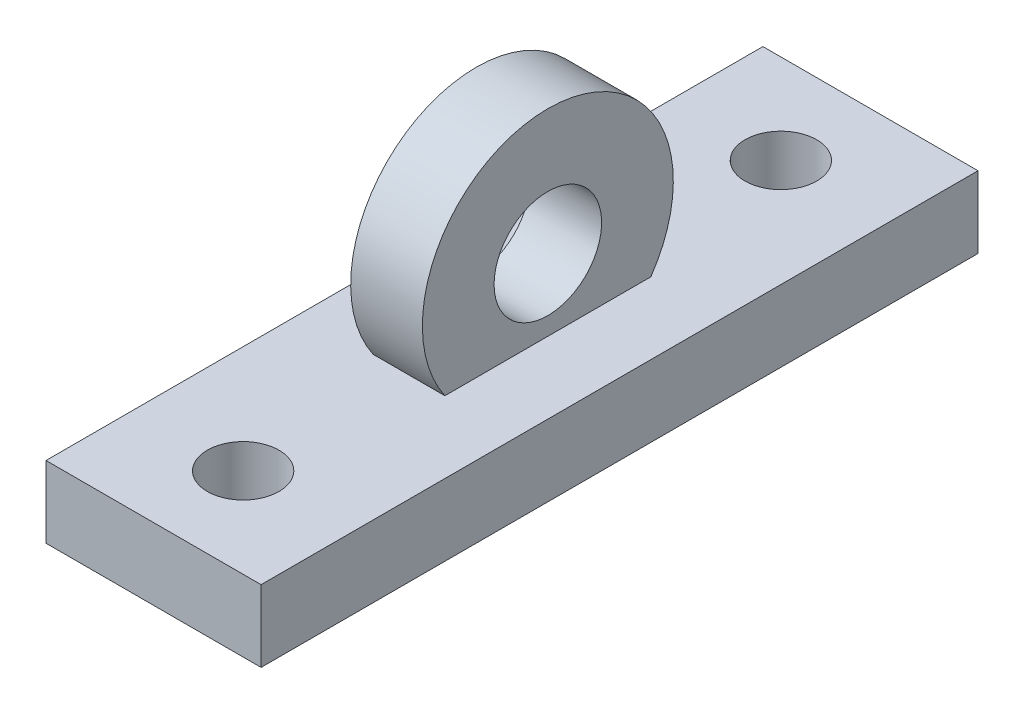
ISO-10303-21;
HEADER;
FILE_DESCRIPTION(('STEP AP214'),'2;1');
FILE_NAME('part.step','',(''),(''),'','','');
FILE_SCHEMA(('AUTOMOTIVE_DESIGN { 1 0 10303 214 1 1 1 1 }'));
ENDSEC;
DATA;
#1=APPLICATION_CONTEXT('core data for automotive mechanical design processes');
#2=APPLICATION_PROTOCOL_DEFINITION('international standard','automotive_design',2000,#1);
#3=PRODUCT_CONTEXT('',#1,'mechanical');
#4=PRODUCT('Part','Part','',(#3));
#5=PRODUCT_RELATED_PRODUCT_CATEGORY('part','',(#4));
#6=PRODUCT_DEFINITION_FORMATION('','',#4);
#7=PRODUCT_DEFINITION_CONTEXT('part definition',#1,'design');
#8=PRODUCT_DEFINITION('design','',#6,#7);
#9=PRODUCT_DEFINITION_SHAPE('','',#8);
#10=(LENGTH_UNIT() NAMED_UNIT(*) SI_UNIT(.MILLI.,.METRE.));
#11=(NAMED_UNIT(*) PLANE_ANGLE_UNIT() SI_UNIT($,.RADIAN.));
#12=(NAMED_UNIT(*) SI_UNIT($,.STERADIAN.) SOLID_ANGLE_UNIT());
#13=UNCERTAINTY_MEASURE_WITH_UNIT(LENGTH_MEASURE(1.E-05),#10,'distance_accuracy_value','');
#14=(GEOMETRIC_REPRESENTATION_CONTEXT(3) GLOBAL_UNCERTAINTY_ASSIGNED_CONTEXT((#13)) GLOBAL_UNIT_ASSIGNED_CONTEXT((#10,
#11,#12)) REPRESENTATION_CONTEXT('',''));
#15=CARTESIAN_POINT('',(0.,0.,0.));
#16=DIRECTION('',(0.,0.,1.));
#17=DIRECTION('',(1.,0.,0.));
#18=AXIS2_PLACEMENT_3D('',#15,#16,#17);
#19=CARTESIAN_POINT('',(0.,2.,0.));
#20=DIRECTION('',(0.,-1.,0.));
#21=DIRECTION('',(0.,0.,-1.));
#22=AXIS2_PLACEMENT_3D('',#19,#20,#21);
#23=PLANE('',#22);
#24=CARTESIAN_POINT('',(0.,2.,7.5));
#25=DIRECTION('',(0.,1.,0.));
#26=DIRECTION('',(0.,0.,1.));
#27=AXIS2_PLACEMENT_3D('',#24,#25,#26);
#28=CIRCLE('',#27,1.);
#29=CARTESIAN_POINT('',(0.,2.,8.5));
#30=VERTEX_POINT('',#29);
#31=EDGE_CURVE('E231',#30,#30,#28,.T.);
#32=ORIENTED_EDGE('',*,*,#31,.F.);
#33=EDGE_LOOP('',(#32));
#34=FACE_BOUND('',#33,.T.);
#35=CARTESIAN_POINT('',(0.,2.,-7.5));
#36=DIRECTION('',(0.,1.,0.));
#37=DIRECTION('',(0.,0.,1.));
#38=AXIS2_PLACEMENT_3D('',#35,#36,#37);
#39=CIRCLE('',#38,1.);
#40=CARTESIAN_POINT('',(0.,2.,-6.5));
#41=VERTEX_POINT('',#40);
#42=EDGE_CURVE('E232',#41,#41,#39,.T.);
#43=ORIENTED_EDGE('',*,*,#42,.F.);
#44=EDGE_LOOP('',(#43));
#45=FACE_BOUND('',#44,.T.);
#46=DIRECTION('',(-1.,0.,0.));
#47=VECTOR('',#46,1.);
#48=CARTESIAN_POINT('',(-3.,2.,-10.));
#49=LINE('',#48,#47);
#50=CARTESIAN_POINT('',(3.,2.,-10.));
#51=VERTEX_POINT('',#50);
#52=CARTESIAN_POINT('',(-3.,2.,-10.));
#53=VERTEX_POINT('',#52);
#54=EDGE_CURVE('E116',#51,#53,#49,.T.);
#55=ORIENTED_EDGE('',*,*,#54,.T.);
#56=DIRECTION('',(0.,0.,1.));
#57=VECTOR('',#56,1.);
#58=CARTESIAN_POINT('',(-3.,2.,10.));
#59=LINE('',#58,#57);
#60=CARTESIAN_POINT('',(-3.,2.,10.));
#61=VERTEX_POINT('',#60);
#62=EDGE_CURVE('E160',#53,#61,#59,.T.);
#63=ORIENTED_EDGE('',*,*,#62,.T.);
#64=DIRECTION('',(1.,0.,0.));
#65=VECTOR('',#64,1.);
#66=CARTESIAN_POINT('',(-3.,2.,10.));
#67=LINE('',#66,#65);
#68=CARTESIAN_POINT('',(3.,2.,10.));
#69=VERTEX_POINT('',#68);
#70=EDGE_CURVE('E88',#61,#69,#67,.T.);
#71=ORIENTED_EDGE('',*,*,#70,.T.);
#72=DIRECTION('',(0.,0.,-1.));
#73=VECTOR('',#72,1.);
#74=CARTESIAN_POINT('',(3.,2.,10.));
#75=LINE('',#74,#73);
#76=EDGE_CURVE('E157',#69,#51,#75,.T.);
#77=ORIENTED_EDGE('',*,*,#76,.T.);
#78=EDGE_LOOP('',(#55,#63,#71,#77));
#79=FACE_BOUND('',#78,.T.);
#80=DIRECTION('',(0.,0.,-1.));
#81=VECTOR('',#80,1.);
#82=CARTESIAN_POINT('',(1.,2.,0.));
#83=LINE('',#82,#81);
#84=CARTESIAN_POINT('',(1.,2.,2.87228132326901));
#85=VERTEX_POINT('',#84);
#86=CARTESIAN_POINT('',(1.,2.,-2.87228132326901));
#87=VERTEX_POINT('',#86);
#88=EDGE_CURVE('E139',#85,#87,#83,.T.);
#89=ORIENTED_EDGE('',*,*,#88,.F.);
#90=DIRECTION('',(-1.,0.,0.));
#91=VECTOR('',#90,1.);
#92=CARTESIAN_POINT('',(1.,2.,2.87228132326901));
#93=LINE('',#92,#91);
#94=CARTESIAN_POINT('',(-1.,2.,2.87228132326901));
#95=VERTEX_POINT('',#94);
#96=EDGE_CURVE('E130',#85,#95,#93,.T.);
#97=ORIENTED_EDGE('',*,*,#96,.T.);
#98=DIRECTION('',(0.,0.,-1.));
#99=VECTOR('',#98,1.);
#100=CARTESIAN_POINT('',(-1.,2.,0.));
#101=LINE('',#100,#99);
#102=CARTESIAN_POINT('',(-1.,2.,-2.87228132326901));
#103=VERTEX_POINT('',#102);
#104=EDGE_CURVE('E125',#95,#103,#101,.T.);
#105=ORIENTED_EDGE('',*,*,#104,.T.);
#106=DIRECTION('',(-1.,0.,0.));
#107=VECTOR('',#106,1.);
#108=CARTESIAN_POINT('',(1.,2.,-2.87228132326901));
#109=LINE('',#108,#107);
#110=EDGE_CURVE('E137',#87,#103,#109,.T.);
#111=ORIENTED_EDGE('',*,*,#110,.F.);
#112=EDGE_LOOP('',(#89,#97,#105,#111));
#113=FACE_BOUND('',#112,.T.);
#114=ADVANCED_FACE('F65',(#34,#45,#79,#113),#23,.F.);
#115=CARTESIAN_POINT('',(3.,2.,10.));
#116=DIRECTION('',(-1.,0.,0.));
#117=DIRECTION('',(0.,0.,1.));
#118=AXIS2_PLACEMENT_3D('',#115,#116,#117);
#119=PLANE('',#118);
#120=DIRECTION('',(0.,0.,-1.));
#121=VECTOR('',#120,1.);
#122=CARTESIAN_POINT('',(3.,0.,10.));
#123=LINE('',#122,#121);
#124=CARTESIAN_POINT('',(3.,0.,10.));
#125=VERTEX_POINT('',#124);
#126=CARTESIAN_POINT('',(3.,0.,-10.));
#127=VERTEX_POINT('',#126);
#128=EDGE_CURVE('E138',#125,#127,#123,.T.);
#129=ORIENTED_EDGE('',*,*,#128,.T.);
#130=DIRECTION('',(0.,-1.,0.));
#131=VECTOR('',#130,1.);
#132=CARTESIAN_POINT('',(3.,2.,-10.));
#133=LINE('',#132,#131);
#134=EDGE_CURVE('E12',#51,#127,#133,.T.);
#135=ORIENTED_EDGE('',*,*,#134,.F.);
#136=ORIENTED_EDGE('',*,*,#76,.F.);
#137=DIRECTION('',(0.,-1.,0.));
#138=VECTOR('',#137,1.);
#139=CARTESIAN_POINT('',(3.,2.,10.));
#140=LINE('',#139,#138);
#141=EDGE_CURVE('E163',#69,#125,#140,.T.);
#142=ORIENTED_EDGE('',*,*,#141,.T.);
#143=EDGE_LOOP('',(#129,#135,#136,#142));
#144=FACE_BOUND('',#143,.T.);
#145=ADVANCED_FACE('F67',(#144),#119,.F.);
#146=CARTESIAN_POINT('',(-3.,2.,-10.));
#147=DIRECTION('',(0.,0.,1.));
#148=DIRECTION('',(1.,0.,0.));
#149=AXIS2_PLACEMENT_3D('',#146,#147,#148);
#150=PLANE('',#149);
#151=DIRECTION('',(0.,-1.,0.));
#152=VECTOR('',#151,1.);
#153=CARTESIAN_POINT('',(-3.,2.,-10.));
#154=LINE('',#153,#152);
#155=CARTESIAN_POINT('',(-3.,0.,-10.));
#156=VERTEX_POINT('',#155);
#157=EDGE_CURVE('E73',#53,#156,#154,.T.);
#158=ORIENTED_EDGE('',*,*,#157,.F.);
#159=ORIENTED_EDGE('',*,*,#54,.F.);
#160=ORIENTED_EDGE('',*,*,#134,.T.);
#161=DIRECTION('',(-1.,0.,0.));
#162=VECTOR('',#161,1.);
#163=CARTESIAN_POINT('',(-3.,0.,-10.));
#164=LINE('',#163,#162);
#165=EDGE_CURVE('E166',#127,#156,#164,.T.);
#166=ORIENTED_EDGE('',*,*,#165,.T.);
#167=EDGE_LOOP('',(#158,#159,#160,#166));
#168=FACE_BOUND('',#167,.T.);
#169=ADVANCED_FACE('F195',(#168),#150,.F.);
#170=CARTESIAN_POINT('',(-3.,2.,10.));
#171=DIRECTION('',(1.,0.,0.));
#172=DIRECTION('',(0.,0.,-1.));
#173=AXIS2_PLACEMENT_3D('',#170,#171,#172);
#174=PLANE('',#173);
#175=DIRECTION('',(0.,0.,1.));
#176=VECTOR('',#175,1.);
#177=CARTESIAN_POINT('',(-3.,0.,10.));
#178=LINE('',#177,#176);
#179=CARTESIAN_POINT('',(-3.,0.,10.));
#180=VERTEX_POINT('',#179);
#181=EDGE_CURVE('E168',#156,#180,#178,.T.);
#182=ORIENTED_EDGE('',*,*,#181,.T.);
#183=DIRECTION('',(0.,-1.,0.));
#184=VECTOR('',#183,1.);
#185=CARTESIAN_POINT('',(-3.,2.,10.));
#186=LINE('',#185,#184);
#187=EDGE_CURVE('E172',#61,#180,#186,.T.);
#188=ORIENTED_EDGE('',*,*,#187,.F.);
#189=ORIENTED_EDGE('',*,*,#62,.F.);
#190=ORIENTED_EDGE('',*,*,#157,.T.);
#191=EDGE_LOOP('',(#182,#188,#189,#190));
#192=FACE_BOUND('',#191,.T.);
#193=ADVANCED_FACE('F177',(#192),#174,.F.);
#194=CARTESIAN_POINT('',(-3.,2.,10.));
#195=DIRECTION('',(0.,0.,-1.));
#196=DIRECTION('',(-1.,0.,0.));
#197=AXIS2_PLACEMENT_3D('',#194,#195,#196);
#198=PLANE('',#197);
#199=DIRECTION('',(1.,0.,0.));
#200=VECTOR('',#199,1.);
#201=CARTESIAN_POINT('',(-3.,0.,10.));
#202=LINE('',#201,#200);
#203=EDGE_CURVE('E109',#180,#125,#202,.T.);
#204=ORIENTED_EDGE('',*,*,#203,.T.);
#205=ORIENTED_EDGE('',*,*,#141,.F.);
#206=ORIENTED_EDGE('',*,*,#70,.F.);
#207=ORIENTED_EDGE('',*,*,#187,.T.);
#208=EDGE_LOOP('',(#204,#205,#206,#207));
#209=FACE_BOUND('',#208,.T.);
#210=ADVANCED_FACE('F185',(#209),#198,.F.);
#211=CARTESIAN_POINT('',(0.,0.,0.));
#212=DIRECTION('',(0.,-1.,0.));
#213=DIRECTION('',(0.,0.,-1.));
#214=AXIS2_PLACEMENT_3D('',#211,#212,#213);
#215=PLANE('',#214);
#216=CARTESIAN_POINT('',(0.,0.,7.5));
#217=DIRECTION('',(0.,1.,0.));
#218=DIRECTION('',(0.,0.,1.));
#219=AXIS2_PLACEMENT_3D('',#216,#217,#218);
#220=CIRCLE('',#219,1.);
#221=CARTESIAN_POINT('',(0.,0.,8.5));
#222=VERTEX_POINT('',#221);
#223=EDGE_CURVE('E131',#222,#222,#220,.T.);
#224=ORIENTED_EDGE('',*,*,#223,.T.);
#225=EDGE_LOOP('',(#224));
#226=FACE_BOUND('',#225,.T.);
#227=CARTESIAN_POINT('',(0.,0.,-7.5));
#228=DIRECTION('',(0.,1.,0.));
#229=DIRECTION('',(0.,0.,1.));
#230=AXIS2_PLACEMENT_3D('',#227,#228,#229);
#231=CIRCLE('',#230,1.);
#232=CARTESIAN_POINT('',(0.,0.,-6.5));
#233=VERTEX_POINT('',#232);
#234=EDGE_CURVE('E149',#233,#233,#231,.T.);
#235=ORIENTED_EDGE('',*,*,#234,.T.);
#236=EDGE_LOOP('',(#235));
#237=FACE_BOUND('',#236,.T.);
#238=ORIENTED_EDGE('',*,*,#181,.F.);
#239=ORIENTED_EDGE('',*,*,#165,.F.);
#240=ORIENTED_EDGE('',*,*,#128,.F.);
#241=ORIENTED_EDGE('',*,*,#203,.F.);
#242=EDGE_LOOP('',(#238,#239,#240,#241));
#243=FACE_BOUND('',#242,.T.);
#244=ADVANCED_FACE('F180',(#226,#237,#243),#215,.T.);
#245=CARTESIAN_POINT('',(1.,4.,0.));
#246=DIRECTION('',(-1.,0.,0.));
#247=DIRECTION('',(0.,0.,1.));
#248=AXIS2_PLACEMENT_3D('',#245,#246,#247);
#249=CYLINDRICAL_SURFACE('',#248,1.5);
#250=CARTESIAN_POINT('',(1.,4.,0.));
#251=DIRECTION('',(-1.,0.,0.));
#252=DIRECTION('',(0.,0.,1.));
#253=AXIS2_PLACEMENT_3D('',#250,#251,#252);
#254=CIRCLE('',#253,1.5);
#255=CARTESIAN_POINT('',(1.,4.,1.5));
#256=VERTEX_POINT('',#255);
#257=EDGE_CURVE('E151',#256,#256,#254,.T.);
#258=ORIENTED_EDGE('',*,*,#257,.F.);
#259=EDGE_LOOP('',(#258));
#260=FACE_BOUND('',#259,.T.);
#261=CARTESIAN_POINT('',(-1.,4.,0.));
#262=DIRECTION('',(-1.,0.,0.));
#263=DIRECTION('',(0.,0.,1.));
#264=AXIS2_PLACEMENT_3D('',#261,#262,#263);
#265=CIRCLE('',#264,1.5);
#266=CARTESIAN_POINT('',(-1.,4.,1.5));
#267=VERTEX_POINT('',#266);
#268=EDGE_CURVE('E142',#267,#267,#265,.T.);
#269=ORIENTED_EDGE('',*,*,#268,.T.);
#270=EDGE_LOOP('',(#269));
#271=FACE_BOUND('',#270,.T.);
#272=ADVANCED_FACE('F192',(#260,#271),#249,.F.);
#273=CARTESIAN_POINT('',(1.,4.,0.));
#274=DIRECTION('',(-1.,0.,0.));
#275=DIRECTION('',(0.,0.,1.));
#276=AXIS2_PLACEMENT_3D('',#273,#274,#275);
#277=CYLINDRICAL_SURFACE('',#276,3.5);
#278=CARTESIAN_POINT('',(-1.,4.,0.));
#279=DIRECTION('',(-1.,0.,0.));
#280=DIRECTION('',(0.,0.,1.));
#281=AXIS2_PLACEMENT_3D('',#278,#279,#280);
#282=CIRCLE('',#281,3.5);
#283=EDGE_CURVE('E79',#95,#103,#282,.T.);
#284=ORIENTED_EDGE('',*,*,#283,.F.);
#285=ORIENTED_EDGE('',*,*,#96,.F.);
#286=CARTESIAN_POINT('',(1.,4.,0.));
#287=DIRECTION('',(-1.,0.,0.));
#288=DIRECTION('',(0.,0.,1.));
#289=AXIS2_PLACEMENT_3D('',#286,#287,#288);
#290=CIRCLE('',#289,3.5);
#291=EDGE_CURVE('E145',#85,#87,#290,.T.);
#292=ORIENTED_EDGE('',*,*,#291,.T.);
#293=ORIENTED_EDGE('',*,*,#110,.T.);
#294=EDGE_LOOP('',(#284,#285,#292,#293));
#295=FACE_BOUND('',#294,.T.);
#296=ADVANCED_FACE('F134',(#295),#277,.T.);
#297=CARTESIAN_POINT('',(1.,0.,0.));
#298=DIRECTION('',(-1.,0.,0.));
#299=DIRECTION('',(0.,0.,1.));
#300=AXIS2_PLACEMENT_3D('',#297,#298,#299);
#301=PLANE('',#300);
#302=ORIENTED_EDGE('',*,*,#257,.T.);
#303=EDGE_LOOP('',(#302));
#304=FACE_BOUND('',#303,.T.);
#305=ORIENTED_EDGE('',*,*,#88,.T.);
#306=ORIENTED_EDGE('',*,*,#291,.F.);
#307=EDGE_LOOP('',(#305,#306));
#308=FACE_BOUND('',#307,.T.);
#309=ADVANCED_FACE('F206',(#304,#308),#301,.F.);
#310=CARTESIAN_POINT('',(-1.,0.,0.));
#311=DIRECTION('',(-1.,0.,0.));
#312=DIRECTION('',(0.,0.,1.));
#313=AXIS2_PLACEMENT_3D('',#310,#311,#312);
#314=PLANE('',#313);
#315=ORIENTED_EDGE('',*,*,#268,.F.);
#316=EDGE_LOOP('',(#315));
#317=FACE_BOUND('',#316,.T.);
#318=ORIENTED_EDGE('',*,*,#104,.F.);
#319=ORIENTED_EDGE('',*,*,#283,.T.);
#320=EDGE_LOOP('',(#318,#319));
#321=FACE_BOUND('',#320,.T.);
#322=ADVANCED_FACE('F126',(#317,#321),#314,.T.);
#323=CARTESIAN_POINT('',(0.,0.,-7.5));
#324=DIRECTION('',(0.,1.,0.));
#325=DIRECTION('',(0.,0.,1.));
#326=AXIS2_PLACEMENT_3D('',#323,#324,#325);
#327=CYLINDRICAL_SURFACE('',#326,1.);
#328=ORIENTED_EDGE('',*,*,#234,.F.);
#329=EDGE_LOOP('',(#328));
#330=FACE_BOUND('',#329,.T.);
#331=ORIENTED_EDGE('',*,*,#42,.T.);
#332=EDGE_LOOP('',(#331));
#333=FACE_BOUND('',#332,.T.);
#334=ADVANCED_FACE('F212',(#330,#333),#327,.F.);
#335=CARTESIAN_POINT('',(0.,0.,7.5));
#336=DIRECTION('',(0.,1.,0.));
#337=DIRECTION('',(0.,0.,1.));
#338=AXIS2_PLACEMENT_3D('',#335,#336,#337);
#339=CYLINDRICAL_SURFACE('',#338,1.);
#340=ORIENTED_EDGE('',*,*,#223,.F.);
#341=EDGE_LOOP('',(#340));
#342=FACE_BOUND('',#341,.T.);
#343=ORIENTED_EDGE('',*,*,#31,.T.);
#344=EDGE_LOOP('',(#343));
#345=FACE_BOUND('',#344,.T.);
#346=ADVANCED_FACE('F221',(#342,#345),#339,.F.);
#347=CLOSED_SHELL('',(#114,#145,#169,#193,#210,#244,#272,#296,#309,#322,#334,#346));
#348=MANIFOLD_SOLID_BREP('B2',#347);
#349=ADVANCED_BREP_SHAPE_REPRESENTATION('',(#18,#348),#14);
#350=SHAPE_DEFINITION_REPRESENTATION(#9,#349);
ENDSEC;
END-ISO-10303-21;
